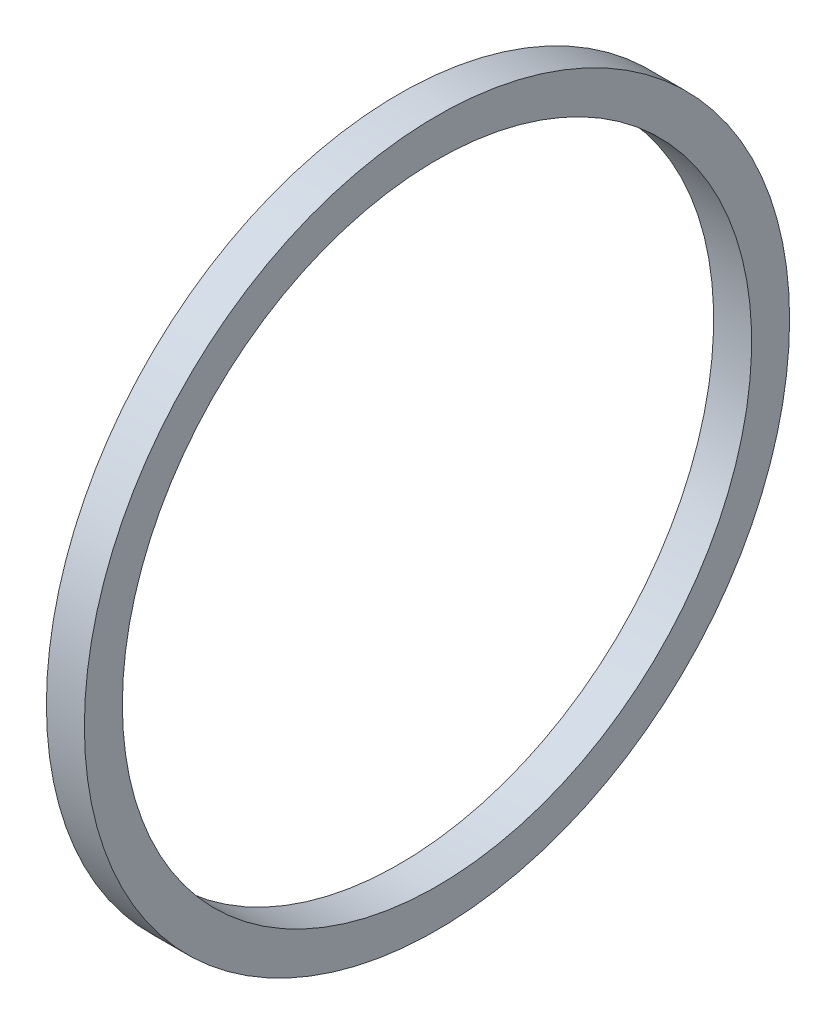
ISO-10303-21;
HEADER;
FILE_DESCRIPTION(('STEP AP214'),'2;1');
FILE_NAME('part.step','',(''),(''),'','','');
FILE_SCHEMA(('AUTOMOTIVE_DESIGN { 1 0 10303 214 1 1 1 1 }'));
ENDSEC;
DATA;
#1=APPLICATION_CONTEXT('core data for automotive mechanical design processes');
#2=APPLICATION_PROTOCOL_DEFINITION('international standard','automotive_design',2000,#1);
#3=PRODUCT_CONTEXT('',#1,'mechanical');
#4=PRODUCT('Part','Part','',(#3));
#5=PRODUCT_RELATED_PRODUCT_CATEGORY('part','',(#4));
#6=PRODUCT_DEFINITION_FORMATION('','',#4);
#7=PRODUCT_DEFINITION_CONTEXT('part definition',#1,'design');
#8=PRODUCT_DEFINITION('design','',#6,#7);
#9=PRODUCT_DEFINITION_SHAPE('','',#8);
#10=(LENGTH_UNIT() NAMED_UNIT(*) SI_UNIT(.MILLI.,.METRE.));
#11=(NAMED_UNIT(*) PLANE_ANGLE_UNIT() SI_UNIT($,.RADIAN.));
#12=(NAMED_UNIT(*) SI_UNIT($,.STERADIAN.) SOLID_ANGLE_UNIT());
#13=UNCERTAINTY_MEASURE_WITH_UNIT(LENGTH_MEASURE(1.E-05),#10,'distance_accuracy_value','');
#14=(GEOMETRIC_REPRESENTATION_CONTEXT(3) GLOBAL_UNCERTAINTY_ASSIGNED_CONTEXT((#13)) GLOBAL_UNIT_ASSIGNED_CONTEXT((#10,
#11,#12)) REPRESENTATION_CONTEXT('',''));
#15=CARTESIAN_POINT('',(0.,0.,0.));
#16=DIRECTION('',(0.,0.,1.));
#17=DIRECTION('',(1.,0.,0.));
#18=AXIS2_PLACEMENT_3D('',#15,#16,#17);
#19=CARTESIAN_POINT('',(0.,0.,0.));
#20=DIRECTION('',(1.,0.,0.));
#21=DIRECTION('',(0.,0.,-1.));
#22=AXIS2_PLACEMENT_3D('',#19,#20,#21);
#23=PLANE('',#22);
#24=CARTESIAN_POINT('',(0.,0.,0.));
#25=DIRECTION('',(-1.,0.,0.));
#26=DIRECTION('',(0.,0.,1.));
#27=AXIS2_PLACEMENT_3D('',#24,#25,#26);
#28=CIRCLE('',#27,17.4);
#29=CARTESIAN_POINT('',(0.,0.,17.4));
#30=VERTEX_POINT('',#29);
#31=EDGE_CURVE('E27',#30,#30,#28,.F.);
#32=ORIENTED_EDGE('',*,*,#31,.T.);
#33=EDGE_LOOP('',(#32));
#34=FACE_BOUND('',#33,.T.);
#35=CARTESIAN_POINT('',(0.,0.,0.));
#36=DIRECTION('',(-1.,0.,0.));
#37=DIRECTION('',(0.,0.,1.));
#38=AXIS2_PLACEMENT_3D('',#35,#36,#37);
#39=CIRCLE('',#38,19.5);
#40=CARTESIAN_POINT('',(0.,0.,19.5));
#41=VERTEX_POINT('',#40);
#42=EDGE_CURVE('E18',#41,#41,#39,.F.);
#43=ORIENTED_EDGE('',*,*,#42,.F.);
#44=EDGE_LOOP('',(#43));
#45=FACE_BOUND('',#44,.T.);
#46=ADVANCED_FACE('F15',(#34,#45),#23,.F.);
#47=CARTESIAN_POINT('',(2.1,0.,0.));
#48=DIRECTION('',(-1.,0.,0.));
#49=DIRECTION('',(0.,0.,1.));
#50=AXIS2_PLACEMENT_3D('',#47,#48,#49);
#51=CYLINDRICAL_SURFACE('',#50,19.5);
#52=ORIENTED_EDGE('',*,*,#42,.T.);
#53=EDGE_LOOP('',(#52));
#54=FACE_BOUND('',#53,.T.);
#55=CARTESIAN_POINT('',(2.1,0.,0.));
#56=DIRECTION('',(-1.,0.,0.));
#57=DIRECTION('',(0.,0.,1.));
#58=AXIS2_PLACEMENT_3D('',#55,#56,#57);
#59=CIRCLE('',#58,19.5);
#60=CARTESIAN_POINT('',(2.1,0.,19.5));
#61=VERTEX_POINT('',#60);
#62=EDGE_CURVE('E22',#61,#61,#59,.F.);
#63=ORIENTED_EDGE('',*,*,#62,.F.);
#64=EDGE_LOOP('',(#63));
#65=FACE_BOUND('',#64,.T.);
#66=ADVANCED_FACE('F35',(#54,#65),#51,.T.);
#67=CARTESIAN_POINT('',(2.1,0.,0.));
#68=DIRECTION('',(-1.,0.,0.));
#69=DIRECTION('',(0.,0.,1.));
#70=AXIS2_PLACEMENT_3D('',#67,#68,#69);
#71=CYLINDRICAL_SURFACE('',#70,17.4);
#72=CARTESIAN_POINT('',(2.1,0.,0.));
#73=DIRECTION('',(-1.,0.,0.));
#74=DIRECTION('',(0.,0.,1.));
#75=AXIS2_PLACEMENT_3D('',#72,#73,#74);
#76=CIRCLE('',#75,17.4);
#77=CARTESIAN_POINT('',(2.1,0.,17.4));
#78=VERTEX_POINT('',#77);
#79=EDGE_CURVE('E10',#78,#78,#76,.T.);
#80=ORIENTED_EDGE('',*,*,#79,.F.);
#81=EDGE_LOOP('',(#80));
#82=FACE_BOUND('',#81,.T.);
#83=ORIENTED_EDGE('',*,*,#31,.F.);
#84=EDGE_LOOP('',(#83));
#85=FACE_BOUND('',#84,.T.);
#86=ADVANCED_FACE('F43',(#82,#85),#71,.F.);
#87=CARTESIAN_POINT('',(2.1,0.,0.));
#88=DIRECTION('',(1.,0.,0.));
#89=DIRECTION('',(0.,0.,-1.));
#90=AXIS2_PLACEMENT_3D('',#87,#88,#89);
#91=PLANE('',#90);
#92=ORIENTED_EDGE('',*,*,#79,.T.);
#93=EDGE_LOOP('',(#92));
#94=FACE_BOUND('',#93,.T.);
#95=ORIENTED_EDGE('',*,*,#62,.T.);
#96=EDGE_LOOP('',(#95));
#97=FACE_BOUND('',#96,.T.);
#98=ADVANCED_FACE('F44',(#94,#97),#91,.T.);
#99=CLOSED_SHELL('',(#46,#66,#86,#98));
#100=MANIFOLD_SOLID_BREP('B1',#99);
#101=ADVANCED_BREP_SHAPE_REPRESENTATION('',(#18,#100),#14);
#102=SHAPE_DEFINITION_REPRESENTATION(#9,#101);
ENDSEC;
END-ISO-10303-21;
